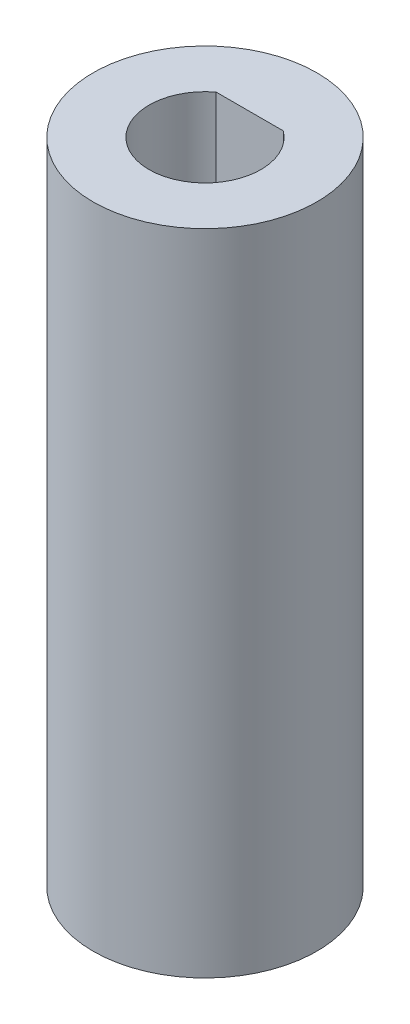
ISO-10303-21;
HEADER;
FILE_DESCRIPTION(('STEP AP214'),'2;1');
FILE_NAME('part.step','',(''),(''),'','','');
FILE_SCHEMA(('AUTOMOTIVE_DESIGN { 1 0 10303 214 1 1 1 1 }'));
ENDSEC;
DATA;
#1=APPLICATION_CONTEXT('core data for automotive mechanical design processes');
#2=APPLICATION_PROTOCOL_DEFINITION('international standard','automotive_design',2000,#1);
#3=PRODUCT_CONTEXT('',#1,'mechanical');
#4=PRODUCT('Part','Part','',(#3));
#5=PRODUCT_RELATED_PRODUCT_CATEGORY('part','',(#4));
#6=PRODUCT_DEFINITION_FORMATION('','',#4);
#7=PRODUCT_DEFINITION_CONTEXT('part definition',#1,'design');
#8=PRODUCT_DEFINITION('design','',#6,#7);
#9=PRODUCT_DEFINITION_SHAPE('','',#8);
#10=(LENGTH_UNIT() NAMED_UNIT(*) SI_UNIT(.MILLI.,.METRE.));
#11=(NAMED_UNIT(*) PLANE_ANGLE_UNIT() SI_UNIT($,.RADIAN.));
#12=(NAMED_UNIT(*) SI_UNIT($,.STERADIAN.) SOLID_ANGLE_UNIT());
#13=UNCERTAINTY_MEASURE_WITH_UNIT(LENGTH_MEASURE(1.E-05),#10,'distance_accuracy_value','');
#14=(GEOMETRIC_REPRESENTATION_CONTEXT(3) GLOBAL_UNCERTAINTY_ASSIGNED_CONTEXT((#13)) GLOBAL_UNIT_ASSIGNED_CONTEXT((#10,
#11,#12)) REPRESENTATION_CONTEXT('',''));
#15=CARTESIAN_POINT('',(0.,0.,0.));
#16=DIRECTION('',(0.,0.,1.));
#17=DIRECTION('',(1.,0.,0.));
#18=AXIS2_PLACEMENT_3D('',#15,#16,#17);
#19=CARTESIAN_POINT('',(0.,29.,0.));
#20=DIRECTION('',(0.,-1.,0.));
#21=DIRECTION('',(0.,0.,-1.));
#22=AXIS2_PLACEMENT_3D('',#19,#20,#21);
#23=CYLINDRICAL_SURFACE('',#22,2.5);
#24=CARTESIAN_POINT('',(0.,0.,0.));
#25=DIRECTION('',(0.,1.,0.));
#26=DIRECTION('',(0.,0.,1.));
#27=AXIS2_PLACEMENT_3D('',#24,#25,#26);
#28=CIRCLE('',#27,2.5);
#29=CARTESIAN_POINT('',(-1.5,0.,-2.));
#30=VERTEX_POINT('',#29);
#31=CARTESIAN_POINT('',(1.5,0.,-2.));
#32=VERTEX_POINT('',#31);
#33=EDGE_CURVE('E76',#30,#32,#28,.T.);
#34=ORIENTED_EDGE('',*,*,#33,.F.);
#35=DIRECTION('',(0.,-1.,0.));
#36=VECTOR('',#35,1.);
#37=CARTESIAN_POINT('',(-1.5,29.,-2.));
#38=LINE('',#37,#36);
#39=CARTESIAN_POINT('',(-1.5,29.,-2.));
#40=VERTEX_POINT('',#39);
#41=EDGE_CURVE('E11',#40,#30,#38,.T.);
#42=ORIENTED_EDGE('',*,*,#41,.F.);
#43=CARTESIAN_POINT('',(0.,29.,0.));
#44=DIRECTION('',(0.,1.,0.));
#45=DIRECTION('',(0.,0.,1.));
#46=AXIS2_PLACEMENT_3D('',#43,#44,#45);
#47=CIRCLE('',#46,2.5);
#48=CARTESIAN_POINT('',(1.5,29.,-2.));
#49=VERTEX_POINT('',#48);
#50=EDGE_CURVE('E77',#40,#49,#47,.T.);
#51=ORIENTED_EDGE('',*,*,#50,.T.);
#52=DIRECTION('',(0.,-1.,0.));
#53=VECTOR('',#52,1.);
#54=CARTESIAN_POINT('',(1.5,29.,-2.));
#55=LINE('',#54,#53);
#56=EDGE_CURVE('E56',#49,#32,#55,.T.);
#57=ORIENTED_EDGE('',*,*,#56,.T.);
#58=EDGE_LOOP('',(#34,#42,#51,#57));
#59=FACE_BOUND('',#58,.T.);
#60=ADVANCED_FACE('F47',(#59),#23,.F.);
#61=CARTESIAN_POINT('',(0.,29.,-2.));
#62=DIRECTION('',(0.,0.,-1.));
#63=DIRECTION('',(-1.,0.,0.));
#64=AXIS2_PLACEMENT_3D('',#61,#62,#63);
#65=PLANE('',#64);
#66=DIRECTION('',(1.,0.,0.));
#67=VECTOR('',#66,1.);
#68=CARTESIAN_POINT('',(0.,0.,-2.));
#69=LINE('',#68,#67);
#70=EDGE_CURVE('E80',#30,#32,#69,.T.);
#71=ORIENTED_EDGE('',*,*,#70,.T.);
#72=ORIENTED_EDGE('',*,*,#56,.F.);
#73=DIRECTION('',(1.,0.,0.));
#74=VECTOR('',#73,1.);
#75=CARTESIAN_POINT('',(0.,29.,-2.));
#76=LINE('',#75,#74);
#77=EDGE_CURVE('E63',#40,#49,#76,.T.);
#78=ORIENTED_EDGE('',*,*,#77,.F.);
#79=ORIENTED_EDGE('',*,*,#41,.T.);
#80=EDGE_LOOP('',(#71,#72,#78,#79));
#81=FACE_BOUND('',#80,.T.);
#82=ADVANCED_FACE('F81',(#81),#65,.F.);
#83=CARTESIAN_POINT('',(0.,29.,0.));
#84=DIRECTION('',(0.,-1.,0.));
#85=DIRECTION('',(0.,0.,-1.));
#86=AXIS2_PLACEMENT_3D('',#83,#84,#85);
#87=CYLINDRICAL_SURFACE('',#86,5.);
#88=CARTESIAN_POINT('',(0.,29.,0.));
#89=DIRECTION('',(0.,1.,0.));
#90=DIRECTION('',(0.,0.,1.));
#91=AXIS2_PLACEMENT_3D('',#88,#89,#90);
#92=CIRCLE('',#91,5.);
#93=CARTESIAN_POINT('',(0.,29.,-5.));
#94=VERTEX_POINT('',#93);
#95=EDGE_CURVE('E79',#94,#94,#92,.T.);
#96=CARTESIAN_POINT('',(0.,0.,0.));
#97=DIRECTION('',(0.,1.,0.));
#98=DIRECTION('',(0.,0.,1.));
#99=AXIS2_PLACEMENT_3D('',#96,#97,#98);
#100=CIRCLE('',#99,5.);
#101=CARTESIAN_POINT('',(0.,0.,-5.));
#102=VERTEX_POINT('',#101);
#103=EDGE_CURVE('E84',#102,#102,#100,.T.);
#104=CARTESIAN_POINT('',(0.,29.,-5.));
#105=CARTESIAN_POINT('',(0.,28.6979166666667,-5.));
#106=CARTESIAN_POINT('',(0.,28.3958333333333,-5.));
#107=CARTESIAN_POINT('',(0.,27.7916666666667,-5.));
#108=CARTESIAN_POINT('',(0.,27.4895833333333,-5.));
#109=CARTESIAN_POINT('',(0.,26.8854166666667,-5.));
#110=CARTESIAN_POINT('',(0.,26.5833333333333,-5.));
#111=CARTESIAN_POINT('',(0.,25.9791666666667,-5.));
#112=CARTESIAN_POINT('',(0.,25.6770833333333,-5.));
#113=CARTESIAN_POINT('',(0.,25.0729166666667,-5.));
#114=CARTESIAN_POINT('',(0.,24.7708333333333,-5.));
#115=CARTESIAN_POINT('',(0.,24.1666666666667,-5.));
#116=CARTESIAN_POINT('',(0.,23.8645833333333,-5.));
#117=CARTESIAN_POINT('',(0.,23.2604166666667,-5.));
#118=CARTESIAN_POINT('',(0.,22.9583333333333,-5.));
#119=CARTESIAN_POINT('',(0.,22.3541666666667,-5.));
#120=CARTESIAN_POINT('',(0.,22.0520833333333,-5.));
#121=CARTESIAN_POINT('',(0.,21.4479166666667,-5.));
#122=CARTESIAN_POINT('',(0.,21.1458333333333,-5.));
#123=CARTESIAN_POINT('',(0.,20.5416666666667,-5.));
#124=CARTESIAN_POINT('',(0.,20.2395833333333,-5.));
#125=CARTESIAN_POINT('',(0.,19.6354166666667,-5.));
#126=CARTESIAN_POINT('',(0.,19.3333333333333,-5.));
#127=CARTESIAN_POINT('',(0.,18.7291666666667,-5.));
#128=CARTESIAN_POINT('',(0.,18.4270833333333,-5.));
#129=CARTESIAN_POINT('',(0.,17.8229166666667,-5.));
#130=CARTESIAN_POINT('',(0.,17.5208333333333,-5.));
#131=CARTESIAN_POINT('',(0.,16.9166666666667,-5.));
#132=CARTESIAN_POINT('',(0.,16.6145833333333,-5.));
#133=CARTESIAN_POINT('',(0.,16.0104166666667,-5.));
#134=CARTESIAN_POINT('',(0.,15.7083333333333,-5.));
#135=CARTESIAN_POINT('',(0.,15.1041666666667,-5.));
#136=CARTESIAN_POINT('',(0.,14.8020833333333,-5.));
#137=CARTESIAN_POINT('',(0.,14.1979166666667,-5.));
#138=CARTESIAN_POINT('',(0.,13.8958333333333,-5.));
#139=CARTESIAN_POINT('',(0.,13.2916666666667,-5.));
#140=CARTESIAN_POINT('',(0.,12.9895833333333,-5.));
#141=CARTESIAN_POINT('',(0.,12.3854166666667,-5.));
#142=CARTESIAN_POINT('',(0.,12.0833333333333,-5.));
#143=CARTESIAN_POINT('',(0.,11.4791666666667,-5.));
#144=CARTESIAN_POINT('',(0.,11.1770833333333,-5.));
#145=CARTESIAN_POINT('',(0.,10.5729166666667,-5.));
#146=CARTESIAN_POINT('',(0.,10.2708333333333,-5.));
#147=CARTESIAN_POINT('',(0.,9.66666666666667,-5.));
#148=CARTESIAN_POINT('',(0.,9.36458333333333,-5.));
#149=CARTESIAN_POINT('',(0.,8.76041666666667,-5.));
#150=CARTESIAN_POINT('',(0.,8.45833333333333,-5.));
#151=CARTESIAN_POINT('',(0.,7.85416666666667,-5.));
#152=CARTESIAN_POINT('',(0.,7.55208333333333,-5.));
#153=CARTESIAN_POINT('',(0.,6.94791666666667,-5.));
#154=CARTESIAN_POINT('',(0.,6.64583333333333,-5.));
#155=CARTESIAN_POINT('',(0.,6.04166666666667,-5.));
#156=CARTESIAN_POINT('',(0.,5.73958333333333,-5.));
#157=CARTESIAN_POINT('',(0.,5.13541666666667,-5.));
#158=CARTESIAN_POINT('',(0.,4.83333333333333,-5.));
#159=CARTESIAN_POINT('',(0.,4.22916666666667,-5.));
#160=CARTESIAN_POINT('',(0.,3.92708333333333,-5.));
#161=CARTESIAN_POINT('',(0.,3.32291666666667,-5.));
#162=CARTESIAN_POINT('',(0.,3.02083333333333,-5.));
#163=CARTESIAN_POINT('',(0.,2.41666666666667,-5.));
#164=CARTESIAN_POINT('',(0.,2.11458333333333,-5.));
#165=CARTESIAN_POINT('',(0.,1.51041666666667,-5.));
#166=CARTESIAN_POINT('',(0.,1.20833333333333,-5.));
#167=CARTESIAN_POINT('',(0.,0.604166666666667,-5.));
#168=CARTESIAN_POINT('',(0.,0.302083333333333,-5.));
#169=CARTESIAN_POINT('',(0.,0.,-5.));
#170=B_SPLINE_CURVE_WITH_KNOTS('',3,(#104,#105,#106,#107,#108,#109,#110,#111,#112,#113,#114,
#115,#116,#117,#118,#119,#120,#121,#122,#123,#124,#125,#126,#127,#128,#129,#130,#131,#132,#133,
#134,#135,#136,#137,#138,#139,#140,#141,#142,#143,#144,#145,#146,#147,#148,#149,#150,#151,#152,
#153,#154,#155,#156,#157,#158,#159,#160,#161,#162,#163,#164,#165,#166,#167,#168,#169),
.UNSPECIFIED.,.F.,.F.,(4,2,2,2,2,2,2,2,2,2,2,2,2,2,2,2,2,2,2,2,2,2,2,2,2,2,2,2,2,2,2,2,4),(0.,
0.906249999999997,1.8125,2.71875,3.625,4.53125,5.4375,6.34375,7.25,8.15625,9.0625,9.96875,
10.875,11.78125,12.6875,13.59375,14.5,15.40625,16.3125,17.21875,18.125,19.03125,19.9375,
20.84375,21.75,22.65625,23.5625,24.46875,25.375,26.28125,27.1875,28.09375,29.),.UNSPECIFIED.);
#171=EDGE_CURVE('BSEAM106',#94,#102,#170,.T.);
#172=ORIENTED_EDGE('',*,*,#95,.F.);
#173=ORIENTED_EDGE('',*,*,#103,.T.);
#174=ORIENTED_EDGE('',*,*,#171,.T.);
#175=ORIENTED_EDGE('',*,*,#171,.F.);
#176=EDGE_LOOP('',(#172,#174,#173,#175));
#177=FACE_BOUND('',#176,.T.);
#178=ADVANCED_FACE('F106',(#177),#87,.T.);
#179=CARTESIAN_POINT('',(0.,29.,0.));
#180=DIRECTION('',(0.,1.,0.));
#181=DIRECTION('',(0.,0.,1.));
#182=AXIS2_PLACEMENT_3D('',#179,#180,#181);
#183=PLANE('',#182);
#184=ORIENTED_EDGE('',*,*,#50,.F.);
#185=ORIENTED_EDGE('',*,*,#77,.T.);
#186=EDGE_LOOP('',(#184,#185));
#187=FACE_BOUND('',#186,.T.);
#188=ORIENTED_EDGE('',*,*,#95,.T.);
#189=EDGE_LOOP('',(#188));
#190=FACE_BOUND('',#189,.T.);
#191=ADVANCED_FACE('F104',(#187,#190),#183,.T.);
#192=CARTESIAN_POINT('',(0.,0.,0.));
#193=DIRECTION('',(0.,1.,0.));
#194=DIRECTION('',(0.,0.,1.));
#195=AXIS2_PLACEMENT_3D('',#192,#193,#194);
#196=PLANE('',#195);
#197=ORIENTED_EDGE('',*,*,#33,.T.);
#198=ORIENTED_EDGE('',*,*,#70,.F.);
#199=EDGE_LOOP('',(#197,#198));
#200=FACE_BOUND('',#199,.T.);
#201=ORIENTED_EDGE('',*,*,#103,.F.);
#202=EDGE_LOOP('',(#201));
#203=FACE_BOUND('',#202,.T.);
#204=ADVANCED_FACE('F86',(#200,#203),#196,.F.);
#205=CLOSED_SHELL('',(#60,#82,#178,#191,#204));
#206=MANIFOLD_SOLID_BREP('B2',#205);
#207=ADVANCED_BREP_SHAPE_REPRESENTATION('',(#18,#206),#14);
#208=SHAPE_DEFINITION_REPRESENTATION(#9,#207);
ENDSEC;
END-ISO-10303-21;
